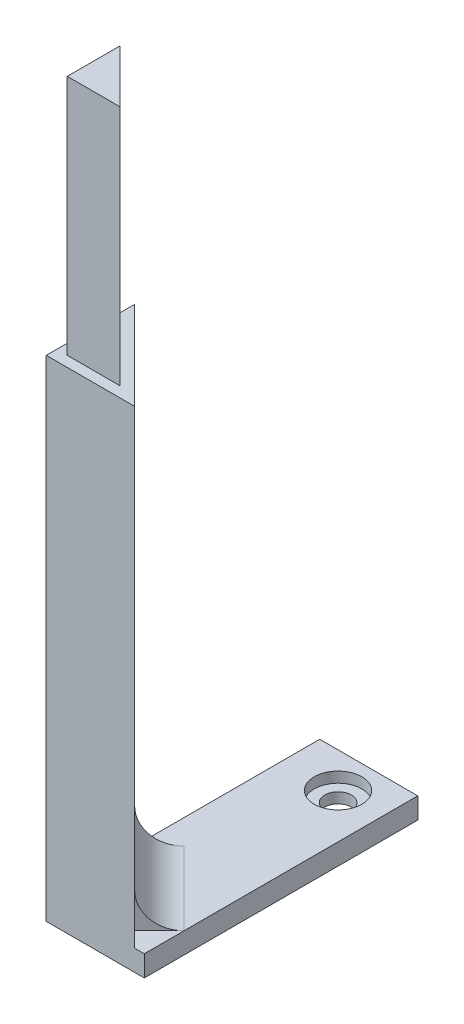
ISO-10303-21;
HEADER;
FILE_DESCRIPTION(('STEP AP214'),'2;1');
FILE_NAME('part.step','',(''),(''),'','','');
FILE_SCHEMA(('AUTOMOTIVE_DESIGN { 1 0 10303 214 1 1 1 1 }'));
ENDSEC;
DATA;
#1=APPLICATION_CONTEXT('core data for automotive mechanical design processes');
#2=APPLICATION_PROTOCOL_DEFINITION('international standard','automotive_design',2000,#1);
#3=PRODUCT_CONTEXT('',#1,'mechanical');
#4=PRODUCT('Part','Part','',(#3));
#5=PRODUCT_RELATED_PRODUCT_CATEGORY('part','',(#4));
#6=PRODUCT_DEFINITION_FORMATION('','',#4);
#7=PRODUCT_DEFINITION_CONTEXT('part definition',#1,'design');
#8=PRODUCT_DEFINITION('design','',#6,#7);
#9=PRODUCT_DEFINITION_SHAPE('','',#8);
#10=(LENGTH_UNIT() NAMED_UNIT(*) SI_UNIT(.MILLI.,.METRE.));
#11=(NAMED_UNIT(*) PLANE_ANGLE_UNIT() SI_UNIT($,.RADIAN.));
#12=(NAMED_UNIT(*) SI_UNIT($,.STERADIAN.) SOLID_ANGLE_UNIT());
#13=UNCERTAINTY_MEASURE_WITH_UNIT(LENGTH_MEASURE(1.E-05),#10,'distance_accuracy_value','');
#14=(GEOMETRIC_REPRESENTATION_CONTEXT(3) GLOBAL_UNCERTAINTY_ASSIGNED_CONTEXT((#13)) GLOBAL_UNIT_ASSIGNED_CONTEXT((#10,
#11,#12)) REPRESENTATION_CONTEXT('',''));
#15=CARTESIAN_POINT('',(0.,0.,0.));
#16=DIRECTION('',(0.,0.,1.));
#17=DIRECTION('',(1.,0.,0.));
#18=AXIS2_PLACEMENT_3D('',#15,#16,#17);
#19=CARTESIAN_POINT('',(12.3,6.,-65.04));
#20=DIRECTION('',(0.,-1.,0.));
#21=DIRECTION('',(0.,0.,-1.));
#22=AXIS2_PLACEMENT_3D('',#19,#20,#21);
#23=CYLINDRICAL_SURFACE('',#22,3.8);
#24=CARTESIAN_POINT('',(12.3,0.,-65.04));
#25=DIRECTION('',(0.,-1.,0.));
#26=DIRECTION('',(0.,0.,-1.));
#27=AXIS2_PLACEMENT_3D('',#24,#25,#26);
#28=CIRCLE('',#27,3.8);
#29=CARTESIAN_POINT('',(12.3,0.,-68.84));
#30=VERTEX_POINT('',#29);
#31=EDGE_CURVE('E180',#30,#30,#28,.T.);
#32=ORIENTED_EDGE('',*,*,#31,.T.);
#33=EDGE_LOOP('',(#32));
#34=FACE_BOUND('',#33,.T.);
#35=CARTESIAN_POINT('',(12.3,3.,-65.04));
#36=DIRECTION('',(0.,1.,0.));
#37=DIRECTION('',(0.,0.,1.));
#38=AXIS2_PLACEMENT_3D('',#35,#36,#37);
#39=CIRCLE('',#38,3.8);
#40=CARTESIAN_POINT('',(12.3,3.,-61.24));
#41=VERTEX_POINT('',#40);
#42=EDGE_CURVE('E44',#41,#41,#39,.F.);
#43=ORIENTED_EDGE('',*,*,#42,.F.);
#44=EDGE_LOOP('',(#43));
#45=FACE_BOUND('',#44,.T.);
#46=ADVANCED_FACE('F40',(#34,#45),#23,.F.);
#47=CARTESIAN_POINT('',(22.2426406871193,140.,3.));
#48=DIRECTION('',(0.707106781186547,0.,-0.707106781186547));
#49=DIRECTION('',(-0.707106781186548,0.,-0.707106781186548));
#50=AXIS2_PLACEMENT_3D('',#47,#48,#49);
#51=PLANE('',#50);
#52=DIRECTION('',(0.707106781186548,0.,0.707106781186548));
#53=VECTOR('',#52,1.);
#54=CARTESIAN_POINT('',(9.62132034355964,6.,-9.62132034355964));
#55=LINE('',#54,#53);
#56=CARTESIAN_POINT('',(17.9289321881345,6.,-1.31370849898476));
#57=VERTEX_POINT('',#56);
#58=CARTESIAN_POINT('',(22.2426406871193,6.,3.));
#59=VERTEX_POINT('',#58);
#60=EDGE_CURVE('E189',#57,#59,#55,.T.);
#61=ORIENTED_EDGE('',*,*,#60,.F.);
#62=DIRECTION('',(0.,-1.,0.));
#63=VECTOR('',#62,1.);
#64=CARTESIAN_POINT('',(17.9289321881345,16.,-1.31370849898476));
#65=LINE('',#64,#63);
#66=CARTESIAN_POINT('',(17.9289321881345,16.,-1.31370849898476));
#67=VERTEX_POINT('',#66);
#68=EDGE_CURVE('E165',#67,#57,#65,.T.);
#69=ORIENTED_EDGE('',*,*,#68,.F.);
#70=DIRECTION('',(0.707106781186548,0.,0.707106781186547));
#71=VECTOR('',#70,1.);
#72=CARTESIAN_POINT('',(17.9289321881345,16.,-1.31370849898476));
#73=LINE('',#72,#71);
#74=CARTESIAN_POINT('',(-3.,16.,-22.2426406871193));
#75=VERTEX_POINT('',#74);
#76=EDGE_CURVE('E131',#75,#67,#73,.T.);
#77=ORIENTED_EDGE('',*,*,#76,.F.);
#78=DIRECTION('',(0.,-1.,0.));
#79=VECTOR('',#78,1.);
#80=CARTESIAN_POINT('',(-3.,140.,-22.2426406871193));
#81=LINE('',#80,#79);
#82=CARTESIAN_POINT('',(-3.,140.,-22.2426406871193));
#83=VERTEX_POINT('',#82);
#84=EDGE_CURVE('E235',#83,#75,#81,.T.);
#85=ORIENTED_EDGE('',*,*,#84,.F.);
#86=DIRECTION('',(0.707106781186547,0.,0.707106781186547));
#87=VECTOR('',#86,1.);
#88=CARTESIAN_POINT('',(22.2426406871193,140.,3.));
#89=LINE('',#88,#87);
#90=CARTESIAN_POINT('',(22.2426406871193,140.,3.));
#91=VERTEX_POINT('',#90);
#92=EDGE_CURVE('E220',#83,#91,#89,.T.);
#93=ORIENTED_EDGE('',*,*,#92,.T.);
#94=DIRECTION('',(0.,-1.,0.));
#95=VECTOR('',#94,1.);
#96=CARTESIAN_POINT('',(22.2426406871193,140.,3.));
#97=LINE('',#96,#95);
#98=EDGE_CURVE('E230',#91,#59,#97,.T.);
#99=ORIENTED_EDGE('',*,*,#98,.T.);
#100=EDGE_LOOP('',(#61,#69,#77,#85,#93,#99));
#101=FACE_BOUND('',#100,.T.);
#102=ADVANCED_FACE('F295',(#101),#51,.T.);
#103=CARTESIAN_POINT('',(0.,6.,0.));
#104=DIRECTION('',(0.,-1.,0.));
#105=DIRECTION('',(0.,0.,-1.));
#106=AXIS2_PLACEMENT_3D('',#103,#104,#105);
#107=PLANE('',#106);
#108=DIRECTION('',(0.707106781186547,0.,-0.707106781186548));
#109=VECTOR('',#108,1.);
#110=CARTESIAN_POINT('',(25.,6.,-8.38477631085024));
#111=LINE('',#110,#109);
#112=CARTESIAN_POINT('',(25.,6.,-8.38477631085024));
#113=VERTEX_POINT('',#112);
#114=EDGE_CURVE('E65',#57,#113,#111,.T.);
#115=ORIENTED_EDGE('',*,*,#114,.F.);
#116=ORIENTED_EDGE('',*,*,#60,.T.);
#117=DIRECTION('',(1.,0.,0.));
#118=VECTOR('',#117,1.);
#119=CARTESIAN_POINT('',(0.,6.,3.));
#120=LINE('',#119,#118);
#121=CARTESIAN_POINT('',(25.,6.,3.));
#122=VERTEX_POINT('',#121);
#123=EDGE_CURVE('E161',#59,#122,#120,.T.);
#124=ORIENTED_EDGE('',*,*,#123,.T.);
#125=DIRECTION('',(0.,0.,-1.));
#126=VECTOR('',#125,1.);
#127=CARTESIAN_POINT('',(25.,6.,0.));
#128=LINE('',#127,#126);
#129=EDGE_CURVE('E152',#122,#113,#128,.T.);
#130=ORIENTED_EDGE('',*,*,#129,.T.);
#131=EDGE_LOOP('',(#115,#116,#124,#130));
#132=FACE_BOUND('',#131,.T.);
#133=ADVANCED_FACE('F159',(#132),#107,.F.);
#134=CARTESIAN_POINT('',(12.3,6.,-65.04));
#135=DIRECTION('',(0.,1.,0.));
#136=DIRECTION('',(0.,0.,1.));
#137=AXIS2_PLACEMENT_3D('',#134,#135,#136);
#138=CIRCLE('',#137,6.8);
#139=CARTESIAN_POINT('',(12.3,6.,-58.24));
#140=VERTEX_POINT('',#139);
#141=EDGE_CURVE('E357',#140,#140,#138,.T.);
#142=ORIENTED_EDGE('',*,*,#141,.F.);
#143=EDGE_LOOP('',(#142));
#144=FACE_BOUND('',#143,.T.);
#145=DIRECTION('',(1.,0.,0.));
#146=VECTOR('',#145,1.);
#147=CARTESIAN_POINT('',(0.,6.,-75.1));
#148=LINE('',#147,#146);
#149=CARTESIAN_POINT('',(-3.,6.,-75.1));
#150=VERTEX_POINT('',#149);
#151=CARTESIAN_POINT('',(25.,6.,-75.1));
#152=VERTEX_POINT('',#151);
#153=EDGE_CURVE('E157',#150,#152,#148,.T.);
#154=ORIENTED_EDGE('',*,*,#153,.F.);
#155=DIRECTION('',(0.,0.,-1.));
#156=VECTOR('',#155,1.);
#157=CARTESIAN_POINT('',(-3.,6.,0.));
#158=LINE('',#157,#156);
#159=CARTESIAN_POINT('',(-3.,6.,-22.2426406871193));
#160=VERTEX_POINT('',#159);
#161=EDGE_CURVE('E181',#160,#150,#158,.T.);
#162=ORIENTED_EDGE('',*,*,#161,.F.);
#163=DIRECTION('',(-0.707106781186547,0.,0.707106781186548));
#164=VECTOR('',#163,1.);
#165=CARTESIAN_POINT('',(-3.,6.,-22.2426406871193));
#166=LINE('',#165,#164);
#167=CARTESIAN_POINT('',(4.07106781186547,6.,-29.3137084989848));
#168=VERTEX_POINT('',#167);
#169=EDGE_CURVE('E145',#168,#160,#166,.T.);
#170=ORIENTED_EDGE('',*,*,#169,.F.);
#171=DIRECTION('',(-0.707106781186548,0.,-0.707106781186547));
#172=VECTOR('',#171,1.);
#173=CARTESIAN_POINT('',(4.07106781186547,6.,-29.3137084989848));
#174=LINE('',#173,#172);
#175=EDGE_CURVE('E130',#113,#168,#174,.T.);
#176=ORIENTED_EDGE('',*,*,#175,.F.);
#177=EDGE_CURVE('E142',#113,#152,#128,.T.);
#178=ORIENTED_EDGE('',*,*,#177,.T.);
#179=EDGE_LOOP('',(#154,#162,#170,#176,#178));
#180=FACE_BOUND('',#179,.T.);
#181=ADVANCED_FACE('F141',(#144,#180),#107,.F.);
#182=CARTESIAN_POINT('',(0.,320.,0.));
#183=DIRECTION('',(0.,0.,-1.));
#184=DIRECTION('',(-1.,0.,0.));
#185=AXIS2_PLACEMENT_3D('',#182,#183,#184);
#186=PLANE('',#185);
#187=DIRECTION('',(0.,-1.,0.));
#188=VECTOR('',#187,1.);
#189=CARTESIAN_POINT('',(0.,320.,0.));
#190=LINE('',#189,#188);
#191=CARTESIAN_POINT('',(0.,209.,0.));
#192=VERTEX_POINT('',#191);
#193=CARTESIAN_POINT('',(0.,140.,0.));
#194=VERTEX_POINT('',#193);
#195=EDGE_CURVE('E258',#192,#194,#190,.T.);
#196=ORIENTED_EDGE('',*,*,#195,.T.);
#197=DIRECTION('',(1.,0.,0.));
#198=VECTOR('',#197,1.);
#199=CARTESIAN_POINT('',(0.,140.,0.));
#200=LINE('',#199,#198);
#201=CARTESIAN_POINT('',(15.,140.,0.));
#202=VERTEX_POINT('',#201);
#203=EDGE_CURVE('E244',#194,#202,#200,.T.);
#204=ORIENTED_EDGE('',*,*,#203,.T.);
#205=DIRECTION('',(0.,-1.,0.));
#206=VECTOR('',#205,1.);
#207=CARTESIAN_POINT('',(15.,320.,0.));
#208=LINE('',#207,#206);
#209=CARTESIAN_POINT('',(15.,209.,0.));
#210=VERTEX_POINT('',#209);
#211=EDGE_CURVE('E50',#210,#202,#208,.T.);
#212=ORIENTED_EDGE('',*,*,#211,.F.);
#213=DIRECTION('',(1.,0.,0.));
#214=VECTOR('',#213,1.);
#215=CARTESIAN_POINT('',(15.,209.,0.));
#216=LINE('',#215,#214);
#217=EDGE_CURVE('E248',#192,#210,#216,.T.);
#218=ORIENTED_EDGE('',*,*,#217,.F.);
#219=EDGE_LOOP('',(#196,#204,#212,#218));
#220=FACE_BOUND('',#219,.T.);
#221=ADVANCED_FACE('F42',(#220),#186,.F.);
#222=CARTESIAN_POINT('',(0.,320.,-15.));
#223=DIRECTION('',(-0.707106781186548,0.,0.707106781186548));
#224=DIRECTION('',(0.707106781186548,0.,0.707106781186548));
#225=AXIS2_PLACEMENT_3D('',#222,#223,#224);
#226=PLANE('',#225);
#227=ORIENTED_EDGE('',*,*,#211,.T.);
#228=DIRECTION('',(-0.707106781186548,0.,-0.707106781186548));
#229=VECTOR('',#228,1.);
#230=CARTESIAN_POINT('',(0.,140.,-15.));
#231=LINE('',#230,#229);
#232=CARTESIAN_POINT('',(0.,140.,-15.));
#233=VERTEX_POINT('',#232);
#234=EDGE_CURVE('E234',#202,#233,#231,.T.);
#235=ORIENTED_EDGE('',*,*,#234,.T.);
#236=DIRECTION('',(0.,-1.,0.));
#237=VECTOR('',#236,1.);
#238=CARTESIAN_POINT('',(0.,320.,-15.));
#239=LINE('',#238,#237);
#240=CARTESIAN_POINT('',(0.,209.,-15.));
#241=VERTEX_POINT('',#240);
#242=EDGE_CURVE('E262',#241,#233,#239,.T.);
#243=ORIENTED_EDGE('',*,*,#242,.F.);
#244=DIRECTION('',(0.707106781186548,0.,0.707106781186548));
#245=VECTOR('',#244,1.);
#246=CARTESIAN_POINT('',(0.,209.,-15.));
#247=LINE('',#246,#245);
#248=EDGE_CURVE('E254',#241,#210,#247,.T.);
#249=ORIENTED_EDGE('',*,*,#248,.T.);
#250=EDGE_LOOP('',(#227,#235,#243,#249));
#251=FACE_BOUND('',#250,.T.);
#252=ADVANCED_FACE('F270',(#251),#226,.F.);
#253=CARTESIAN_POINT('',(0.,320.,0.));
#254=DIRECTION('',(1.,0.,0.));
#255=DIRECTION('',(0.,0.,-1.));
#256=AXIS2_PLACEMENT_3D('',#253,#254,#255);
#257=PLANE('',#256);
#258=ORIENTED_EDGE('',*,*,#242,.T.);
#259=DIRECTION('',(0.,0.,1.));
#260=VECTOR('',#259,1.);
#261=CARTESIAN_POINT('',(0.,140.,0.));
#262=LINE('',#261,#260);
#263=EDGE_CURVE('E11',#233,#194,#262,.T.);
#264=ORIENTED_EDGE('',*,*,#263,.T.);
#265=ORIENTED_EDGE('',*,*,#195,.F.);
#266=DIRECTION('',(0.,0.,1.));
#267=VECTOR('',#266,1.);
#268=CARTESIAN_POINT('',(0.,209.,-15.));
#269=LINE('',#268,#267);
#270=EDGE_CURVE('E251',#241,#192,#269,.T.);
#271=ORIENTED_EDGE('',*,*,#270,.F.);
#272=EDGE_LOOP('',(#258,#264,#265,#271));
#273=FACE_BOUND('',#272,.T.);
#274=ADVANCED_FACE('F278',(#273),#257,.F.);
#275=CARTESIAN_POINT('',(15.,209.,-15.));
#276=DIRECTION('',(0.,-1.,0.));
#277=DIRECTION('',(0.,0.,-1.));
#278=AXIS2_PLACEMENT_3D('',#275,#276,#277);
#279=PLANE('',#278);
#280=ORIENTED_EDGE('',*,*,#270,.T.);
#281=ORIENTED_EDGE('',*,*,#217,.T.);
#282=ORIENTED_EDGE('',*,*,#248,.F.);
#283=EDGE_LOOP('',(#280,#281,#282));
#284=FACE_BOUND('',#283,.T.);
#285=ADVANCED_FACE('F281',(#284),#279,.F.);
#286=CARTESIAN_POINT('',(0.,140.,0.));
#287=DIRECTION('',(0.,1.,0.));
#288=DIRECTION('',(0.,0.,1.));
#289=AXIS2_PLACEMENT_3D('',#286,#287,#288);
#290=PLANE('',#289);
#291=DIRECTION('',(-1.,0.,0.));
#292=VECTOR('',#291,1.);
#293=CARTESIAN_POINT('',(-3.,140.,3.));
#294=LINE('',#293,#292);
#295=CARTESIAN_POINT('',(-3.,140.,3.));
#296=VERTEX_POINT('',#295);
#297=EDGE_CURVE('E211',#91,#296,#294,.T.);
#298=ORIENTED_EDGE('',*,*,#297,.F.);
#299=ORIENTED_EDGE('',*,*,#92,.F.);
#300=DIRECTION('',(0.,0.,-1.));
#301=VECTOR('',#300,1.);
#302=CARTESIAN_POINT('',(-3.,140.,3.));
#303=LINE('',#302,#301);
#304=EDGE_CURVE('E215',#296,#83,#303,.T.);
#305=ORIENTED_EDGE('',*,*,#304,.F.);
#306=EDGE_LOOP('',(#298,#299,#305));
#307=FACE_BOUND('',#306,.T.);
#308=ORIENTED_EDGE('',*,*,#203,.F.);
#309=ORIENTED_EDGE('',*,*,#263,.F.);
#310=ORIENTED_EDGE('',*,*,#234,.F.);
#311=EDGE_LOOP('',(#308,#309,#310));
#312=FACE_BOUND('',#311,.T.);
#313=ADVANCED_FACE('F276',(#307,#312),#290,.T.);
#314=CARTESIAN_POINT('',(-3.,140.,3.));
#315=DIRECTION('',(0.,0.,1.));
#316=DIRECTION('',(1.,0.,0.));
#317=AXIS2_PLACEMENT_3D('',#314,#315,#316);
#318=PLANE('',#317);
#319=DIRECTION('',(-1.,0.,0.));
#320=VECTOR('',#319,1.);
#321=CARTESIAN_POINT('',(-3.,0.,3.));
#322=LINE('',#321,#320);
#323=CARTESIAN_POINT('',(25.,0.,3.));
#324=VERTEX_POINT('',#323);
#325=CARTESIAN_POINT('',(-3.,0.,3.));
#326=VERTEX_POINT('',#325);
#327=EDGE_CURVE('E205',#324,#326,#322,.T.);
#328=ORIENTED_EDGE('',*,*,#327,.F.);
#329=DIRECTION('',(0.,-1.,0.));
#330=VECTOR('',#329,1.);
#331=CARTESIAN_POINT('',(25.,6.,3.));
#332=LINE('',#331,#330);
#333=EDGE_CURVE('E202',#122,#324,#332,.T.);
#334=ORIENTED_EDGE('',*,*,#333,.F.);
#335=ORIENTED_EDGE('',*,*,#123,.F.);
#336=ORIENTED_EDGE('',*,*,#98,.F.);
#337=ORIENTED_EDGE('',*,*,#297,.T.);
#338=DIRECTION('',(0.,-1.,0.));
#339=VECTOR('',#338,1.);
#340=CARTESIAN_POINT('',(-3.,140.,3.));
#341=LINE('',#340,#339);
#342=EDGE_CURVE('E224',#296,#326,#341,.T.);
#343=ORIENTED_EDGE('',*,*,#342,.T.);
#344=EDGE_LOOP('',(#328,#334,#335,#336,#337,#343));
#345=FACE_BOUND('',#344,.T.);
#346=ADVANCED_FACE('F288',(#345),#318,.T.);
#347=CARTESIAN_POINT('',(-3.,140.,3.));
#348=DIRECTION('',(-1.,0.,0.));
#349=DIRECTION('',(0.,0.,1.));
#350=AXIS2_PLACEMENT_3D('',#347,#348,#349);
#351=PLANE('',#350);
#352=DIRECTION('',(0.,0.,-1.));
#353=VECTOR('',#352,1.);
#354=CARTESIAN_POINT('',(-3.,0.,3.));
#355=LINE('',#354,#353);
#356=CARTESIAN_POINT('',(-3.,0.,-75.1));
#357=VERTEX_POINT('',#356);
#358=EDGE_CURVE('E216',#326,#357,#355,.T.);
#359=ORIENTED_EDGE('',*,*,#358,.F.);
#360=ORIENTED_EDGE('',*,*,#342,.F.);
#361=ORIENTED_EDGE('',*,*,#304,.T.);
#362=ORIENTED_EDGE('',*,*,#84,.T.);
#363=DIRECTION('',(0.,-1.,0.));
#364=VECTOR('',#363,1.);
#365=CARTESIAN_POINT('',(-3.,16.,-22.2426406871193));
#366=LINE('',#365,#364);
#367=EDGE_CURVE('E174',#75,#160,#366,.T.);
#368=ORIENTED_EDGE('',*,*,#367,.T.);
#369=ORIENTED_EDGE('',*,*,#161,.T.);
#370=DIRECTION('',(0.,-1.,0.));
#371=VECTOR('',#370,1.);
#372=CARTESIAN_POINT('',(-3.,6.,-75.1));
#373=LINE('',#372,#371);
#374=EDGE_CURVE('E192',#150,#357,#373,.T.);
#375=ORIENTED_EDGE('',*,*,#374,.T.);
#376=EDGE_LOOP('',(#359,#360,#361,#362,#368,#369,#375));
#377=FACE_BOUND('',#376,.T.);
#378=ADVANCED_FACE('F308',(#377),#351,.T.);
#379=CARTESIAN_POINT('',(0.,0.,0.));
#380=DIRECTION('',(0.,1.,0.));
#381=DIRECTION('',(0.,0.,1.));
#382=AXIS2_PLACEMENT_3D('',#379,#380,#381);
#383=PLANE('',#382);
#384=ORIENTED_EDGE('',*,*,#327,.T.);
#385=ORIENTED_EDGE('',*,*,#358,.T.);
#386=DIRECTION('',(1.,0.,0.));
#387=VECTOR('',#386,1.);
#388=CARTESIAN_POINT('',(0.,0.,-75.1));
#389=LINE('',#388,#387);
#390=CARTESIAN_POINT('',(25.,0.,-75.1));
#391=VERTEX_POINT('',#390);
#392=EDGE_CURVE('E196',#357,#391,#389,.T.);
#393=ORIENTED_EDGE('',*,*,#392,.T.);
#394=DIRECTION('',(0.,0.,-1.));
#395=VECTOR('',#394,1.);
#396=CARTESIAN_POINT('',(25.,0.,0.));
#397=LINE('',#396,#395);
#398=EDGE_CURVE('E184',#324,#391,#397,.T.);
#399=ORIENTED_EDGE('',*,*,#398,.F.);
#400=EDGE_LOOP('',(#384,#385,#393,#399));
#401=FACE_BOUND('',#400,.T.);
#402=ORIENTED_EDGE('',*,*,#31,.F.);
#403=EDGE_LOOP('',(#402));
#404=FACE_BOUND('',#403,.T.);
#405=ADVANCED_FACE('F310',(#401,#404),#383,.F.);
#406=CARTESIAN_POINT('',(25.,6.,0.));
#407=DIRECTION('',(-1.,0.,0.));
#408=DIRECTION('',(0.,0.,1.));
#409=AXIS2_PLACEMENT_3D('',#406,#407,#408);
#410=PLANE('',#409);
#411=ORIENTED_EDGE('',*,*,#398,.T.);
#412=DIRECTION('',(0.,-1.,0.));
#413=VECTOR('',#412,1.);
#414=CARTESIAN_POINT('',(25.,6.,-75.1));
#415=LINE('',#414,#413);
#416=EDGE_CURVE('E154',#152,#391,#415,.T.);
#417=ORIENTED_EDGE('',*,*,#416,.F.);
#418=ORIENTED_EDGE('',*,*,#177,.F.);
#419=ORIENTED_EDGE('',*,*,#129,.F.);
#420=ORIENTED_EDGE('',*,*,#333,.T.);
#421=EDGE_LOOP('',(#411,#417,#418,#419,#420));
#422=FACE_BOUND('',#421,.T.);
#423=ADVANCED_FACE('F150',(#422),#410,.F.);
#424=CARTESIAN_POINT('',(0.,6.,-75.1));
#425=DIRECTION('',(0.,0.,-1.));
#426=DIRECTION('',(-1.,0.,0.));
#427=AXIS2_PLACEMENT_3D('',#424,#425,#426);
#428=PLANE('',#427);
#429=ORIENTED_EDGE('',*,*,#392,.F.);
#430=ORIENTED_EDGE('',*,*,#374,.F.);
#431=ORIENTED_EDGE('',*,*,#153,.T.);
#432=ORIENTED_EDGE('',*,*,#416,.T.);
#433=EDGE_LOOP('',(#429,#430,#431,#432));
#434=FACE_BOUND('',#433,.T.);
#435=ADVANCED_FACE('F305',(#434),#428,.T.);
#436=CARTESIAN_POINT('',(25.,16.,-8.38477631085024));
#437=DIRECTION('',(-0.707106781186548,0.,-0.707106781186547));
#438=DIRECTION('',(-0.707106781186547,0.,0.707106781186548));
#439=AXIS2_PLACEMENT_3D('',#436,#437,#438);
#440=PLANE('',#439);
#441=ORIENTED_EDGE('',*,*,#114,.T.);
#442=CARTESIAN_POINT('',(25.,16.,-8.38477631085024));
#443=DIRECTION('',(0.707106781186548,0.,0.707106781186547));
#444=DIRECTION('',(0.707106781186547,0.,-0.707106781186548));
#445=AXIS2_PLACEMENT_3D('',#442,#443,#444);
#446=CIRCLE('',#445,10.);
#447=EDGE_CURVE('E127',#67,#113,#446,.T.);
#448=ORIENTED_EDGE('',*,*,#447,.F.);
#449=ORIENTED_EDGE('',*,*,#68,.T.);
#450=EDGE_LOOP('',(#441,#448,#449));
#451=FACE_BOUND('',#450,.T.);
#452=ADVANCED_FACE('F164',(#451),#440,.F.);
#453=CARTESIAN_POINT('',(-3.,16.,-22.2426406871193));
#454=DIRECTION('',(0.707106781186548,0.,0.707106781186547));
#455=DIRECTION('',(0.707106781186547,0.,-0.707106781186548));
#456=AXIS2_PLACEMENT_3D('',#453,#454,#455);
#457=PLANE('',#456);
#458=ORIENTED_EDGE('',*,*,#367,.F.);
#459=CARTESIAN_POINT('',(4.07106781186546,16.,-29.3137084989848));
#460=DIRECTION('',(0.707106781186548,0.,0.707106781186547));
#461=DIRECTION('',(0.707106781186547,0.,-0.707106781186548));
#462=AXIS2_PLACEMENT_3D('',#459,#460,#461);
#463=CIRCLE('',#462,10.);
#464=EDGE_CURVE('E57',#75,#168,#463,.T.);
#465=ORIENTED_EDGE('',*,*,#464,.T.);
#466=ORIENTED_EDGE('',*,*,#169,.T.);
#467=EDGE_LOOP('',(#458,#465,#466));
#468=FACE_BOUND('',#467,.T.);
#469=ADVANCED_FACE('F325',(#468),#457,.F.);
#470=CARTESIAN_POINT('',(-22.3576118445749,16.,-55.7423881554251));
#471=DIRECTION('',(0.707106781186548,0.,0.707106781186547));
#472=DIRECTION('',(0.707106781186547,0.,-0.707106781186548));
#473=AXIS2_PLACEMENT_3D('',#470,#471,#472);
#474=CYLINDRICAL_SURFACE('',#473,10.);
#475=ORIENTED_EDGE('',*,*,#76,.T.);
#476=ORIENTED_EDGE('',*,*,#447,.T.);
#477=ORIENTED_EDGE('',*,*,#175,.T.);
#478=ORIENTED_EDGE('',*,*,#464,.F.);
#479=EDGE_LOOP('',(#475,#476,#477,#478));
#480=FACE_BOUND('',#479,.T.);
#481=ADVANCED_FACE('F129',(#480),#474,.F.);
#482=CARTESIAN_POINT('',(12.3,3.,-65.04));
#483=DIRECTION('',(0.,1.,0.));
#484=DIRECTION('',(0.,0.,1.));
#485=AXIS2_PLACEMENT_3D('',#482,#483,#484);
#486=PLANE('',#485);
#487=CARTESIAN_POINT('',(12.3,3.,-65.04));
#488=DIRECTION('',(0.,1.,0.));
#489=DIRECTION('',(0.,0.,1.));
#490=AXIS2_PLACEMENT_3D('',#487,#488,#489);
#491=CIRCLE('',#490,6.8);
#492=CARTESIAN_POINT('',(12.3,3.,-58.24));
#493=VERTEX_POINT('',#492);
#494=EDGE_CURVE('E360',#493,#493,#491,.T.);
#495=ORIENTED_EDGE('',*,*,#494,.T.);
#496=EDGE_LOOP('',(#495));
#497=FACE_BOUND('',#496,.T.);
#498=ORIENTED_EDGE('',*,*,#42,.T.);
#499=EDGE_LOOP('',(#498));
#500=FACE_BOUND('',#499,.T.);
#501=ADVANCED_FACE('F332',(#497,#500),#486,.T.);
#502=CARTESIAN_POINT('',(12.3,3.,-65.04));
#503=DIRECTION('',(0.,1.,0.));
#504=DIRECTION('',(0.,0.,1.));
#505=AXIS2_PLACEMENT_3D('',#502,#503,#504);
#506=CYLINDRICAL_SURFACE('',#505,6.8);
#507=ORIENTED_EDGE('',*,*,#494,.F.);
#508=EDGE_LOOP('',(#507));
#509=FACE_BOUND('',#508,.T.);
#510=ORIENTED_EDGE('',*,*,#141,.T.);
#511=EDGE_LOOP('',(#510));
#512=FACE_BOUND('',#511,.T.);
#513=ADVANCED_FACE('F372',(#509,#512),#506,.F.);
#514=CLOSED_SHELL('',(#46,#102,#133,#181,#221,#252,#274,#285,#313,#346,#378,#405,#423,#435,#452,
#469,#481,#501,#513));
#515=MANIFOLD_SOLID_BREP('B2',#514);
#516=ADVANCED_BREP_SHAPE_REPRESENTATION('',(#18,#515),#14);
#517=SHAPE_DEFINITION_REPRESENTATION(#9,#516);
ENDSEC;
END-ISO-10303-21;
